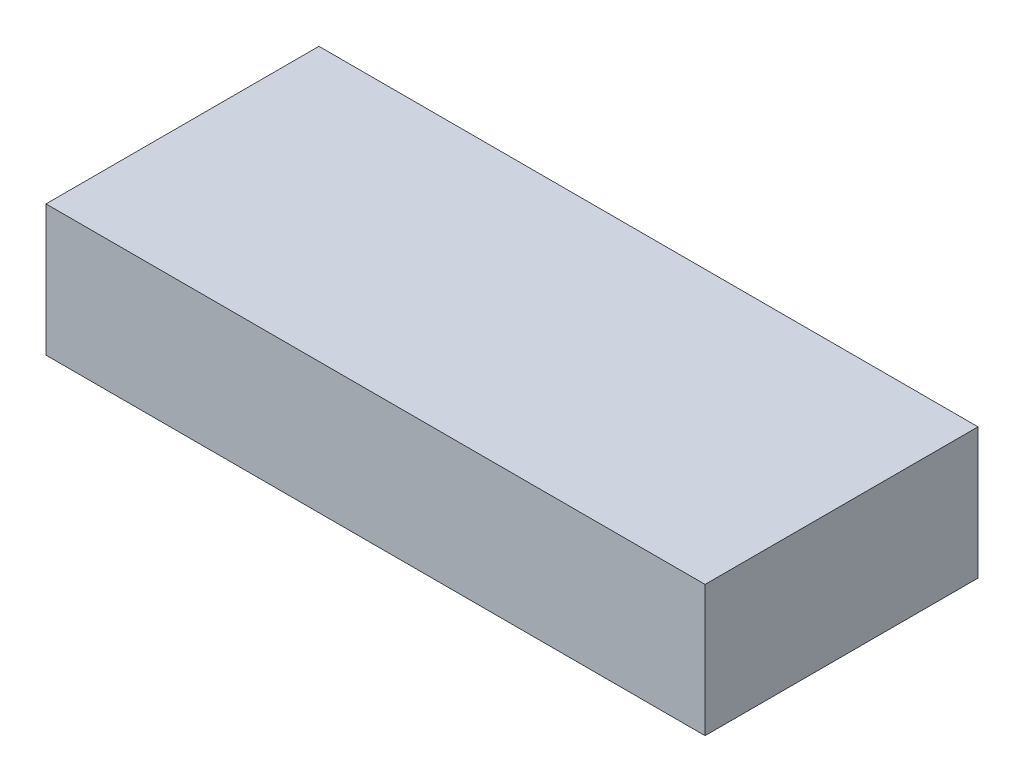
ISO-10303-21;
HEADER;
FILE_DESCRIPTION(('STEP AP214'),'2;1');
FILE_NAME('part.step','',(''),(''),'','','');
FILE_SCHEMA(('AUTOMOTIVE_DESIGN { 1 0 10303 214 1 1 1 1 }'));
ENDSEC;
DATA;
#1=APPLICATION_CONTEXT('core data for automotive mechanical design processes');
#2=APPLICATION_PROTOCOL_DEFINITION('international standard','automotive_design',2000,#1);
#3=PRODUCT_CONTEXT('',#1,'mechanical');
#4=PRODUCT('Part','Part','',(#3));
#5=PRODUCT_RELATED_PRODUCT_CATEGORY('part','',(#4));
#6=PRODUCT_DEFINITION_FORMATION('','',#4);
#7=PRODUCT_DEFINITION_CONTEXT('part definition',#1,'design');
#8=PRODUCT_DEFINITION('design','',#6,#7);
#9=PRODUCT_DEFINITION_SHAPE('','',#8);
#10=(LENGTH_UNIT() NAMED_UNIT(*) SI_UNIT(.MILLI.,.METRE.));
#11=(NAMED_UNIT(*) PLANE_ANGLE_UNIT() SI_UNIT($,.RADIAN.));
#12=(NAMED_UNIT(*) SI_UNIT($,.STERADIAN.) SOLID_ANGLE_UNIT());
#13=UNCERTAINTY_MEASURE_WITH_UNIT(LENGTH_MEASURE(1.E-05),#10,'distance_accuracy_value','');
#14=(GEOMETRIC_REPRESENTATION_CONTEXT(3) GLOBAL_UNCERTAINTY_ASSIGNED_CONTEXT((#13)) GLOBAL_UNIT_ASSIGNED_CONTEXT((#10,
#11,#12)) REPRESENTATION_CONTEXT('',''));
#15=CARTESIAN_POINT('',(0.,0.,0.));
#16=DIRECTION('',(0.,0.,1.));
#17=DIRECTION('',(1.,0.,0.));
#18=AXIS2_PLACEMENT_3D('',#15,#16,#17);
#19=CARTESIAN_POINT('',(25.15,-5.,20.83));
#20=DIRECTION('',(-1.,0.,0.));
#21=DIRECTION('',(0.,0.,1.));
#22=AXIS2_PLACEMENT_3D('',#19,#20,#21);
#23=PLANE('',#22);
#24=DIRECTION('',(0.,1.,0.));
#25=VECTOR('',#24,1.);
#26=CARTESIAN_POINT('',(25.15,-5.,0.));
#27=LINE('',#26,#25);
#28=CARTESIAN_POINT('',(25.15,-5.,0.));
#29=VERTEX_POINT('',#28);
#30=CARTESIAN_POINT('',(25.15,5.,0.));
#31=VERTEX_POINT('',#30);
#32=EDGE_CURVE('E102',#29,#31,#27,.T.);
#33=ORIENTED_EDGE('',*,*,#32,.T.);
#34=DIRECTION('',(0.,0.,-1.));
#35=VECTOR('',#34,1.);
#36=CARTESIAN_POINT('',(25.15,5.,20.83));
#37=LINE('',#36,#35);
#38=CARTESIAN_POINT('',(25.15,5.,20.83));
#39=VERTEX_POINT('',#38);
#40=EDGE_CURVE('E11',#39,#31,#37,.T.);
#41=ORIENTED_EDGE('',*,*,#40,.F.);
#42=DIRECTION('',(0.,1.,0.));
#43=VECTOR('',#42,1.);
#44=CARTESIAN_POINT('',(25.15,-5.,20.83));
#45=LINE('',#44,#43);
#46=CARTESIAN_POINT('',(25.15,-5.,20.83));
#47=VERTEX_POINT('',#46);
#48=EDGE_CURVE('E90',#47,#39,#45,.T.);
#49=ORIENTED_EDGE('',*,*,#48,.F.);
#50=DIRECTION('',(0.,0.,-1.));
#51=VECTOR('',#50,1.);
#52=CARTESIAN_POINT('',(25.15,-5.,20.83));
#53=LINE('',#52,#51);
#54=EDGE_CURVE('E98',#47,#29,#53,.T.);
#55=ORIENTED_EDGE('',*,*,#54,.T.);
#56=EDGE_LOOP('',(#33,#41,#49,#55));
#57=FACE_BOUND('',#56,.T.);
#58=ADVANCED_FACE('F39',(#57),#23,.F.);
#59=CARTESIAN_POINT('',(-25.15,5.,20.83));
#60=DIRECTION('',(0.,-1.,0.));
#61=DIRECTION('',(0.,0.,-1.));
#62=AXIS2_PLACEMENT_3D('',#59,#60,#61);
#63=PLANE('',#62);
#64=DIRECTION('',(-1.,0.,0.));
#65=VECTOR('',#64,1.);
#66=CARTESIAN_POINT('',(-25.15,5.,0.));
#67=LINE('',#66,#65);
#68=CARTESIAN_POINT('',(-25.15,5.,0.));
#69=VERTEX_POINT('',#68);
#70=EDGE_CURVE('E94',#31,#69,#67,.T.);
#71=ORIENTED_EDGE('',*,*,#70,.T.);
#72=DIRECTION('',(0.,0.,-1.));
#73=VECTOR('',#72,1.);
#74=CARTESIAN_POINT('',(-25.15,5.,20.83));
#75=LINE('',#74,#73);
#76=CARTESIAN_POINT('',(-25.15,5.,20.83));
#77=VERTEX_POINT('',#76);
#78=EDGE_CURVE('E47',#77,#69,#75,.T.);
#79=ORIENTED_EDGE('',*,*,#78,.F.);
#80=DIRECTION('',(-1.,0.,0.));
#81=VECTOR('',#80,1.);
#82=CARTESIAN_POINT('',(-25.15,5.,20.83));
#83=LINE('',#82,#81);
#84=EDGE_CURVE('E85',#39,#77,#83,.T.);
#85=ORIENTED_EDGE('',*,*,#84,.F.);
#86=ORIENTED_EDGE('',*,*,#40,.T.);
#87=EDGE_LOOP('',(#71,#79,#85,#86));
#88=FACE_BOUND('',#87,.T.);
#89=ADVANCED_FACE('F93',(#88),#63,.F.);
#90=CARTESIAN_POINT('',(-25.15,-5.,20.83));
#91=DIRECTION('',(1.,0.,0.));
#92=DIRECTION('',(0.,0.,-1.));
#93=AXIS2_PLACEMENT_3D('',#90,#91,#92);
#94=PLANE('',#93);
#95=DIRECTION('',(0.,-1.,0.));
#96=VECTOR('',#95,1.);
#97=CARTESIAN_POINT('',(-25.15,-5.,0.));
#98=LINE('',#97,#96);
#99=CARTESIAN_POINT('',(-25.15,-5.,0.));
#100=VERTEX_POINT('',#99);
#101=EDGE_CURVE('E72',#69,#100,#98,.T.);
#102=ORIENTED_EDGE('',*,*,#101,.T.);
#103=DIRECTION('',(0.,0.,-1.));
#104=VECTOR('',#103,1.);
#105=CARTESIAN_POINT('',(-25.15,-5.,20.83));
#106=LINE('',#105,#104);
#107=CARTESIAN_POINT('',(-25.15,-5.,20.83));
#108=VERTEX_POINT('',#107);
#109=EDGE_CURVE('E95',#108,#100,#106,.T.);
#110=ORIENTED_EDGE('',*,*,#109,.F.);
#111=DIRECTION('',(0.,-1.,0.));
#112=VECTOR('',#111,1.);
#113=CARTESIAN_POINT('',(-25.15,-5.,20.83));
#114=LINE('',#113,#112);
#115=EDGE_CURVE('E88',#77,#108,#114,.T.);
#116=ORIENTED_EDGE('',*,*,#115,.F.);
#117=ORIENTED_EDGE('',*,*,#78,.T.);
#118=EDGE_LOOP('',(#102,#110,#116,#117));
#119=FACE_BOUND('',#118,.T.);
#120=ADVANCED_FACE('F96',(#119),#94,.F.);
#121=CARTESIAN_POINT('',(-25.15,-5.,20.83));
#122=DIRECTION('',(0.,1.,0.));
#123=DIRECTION('',(0.,0.,1.));
#124=AXIS2_PLACEMENT_3D('',#121,#122,#123);
#125=PLANE('',#124);
#126=DIRECTION('',(1.,0.,0.));
#127=VECTOR('',#126,1.);
#128=CARTESIAN_POINT('',(-25.15,-5.,0.));
#129=LINE('',#128,#127);
#130=EDGE_CURVE('E78',#100,#29,#129,.T.);
#131=ORIENTED_EDGE('',*,*,#130,.T.);
#132=ORIENTED_EDGE('',*,*,#54,.F.);
#133=DIRECTION('',(1.,0.,0.));
#134=VECTOR('',#133,1.);
#135=CARTESIAN_POINT('',(-25.15,-5.,20.83));
#136=LINE('',#135,#134);
#137=EDGE_CURVE('E55',#108,#47,#136,.T.);
#138=ORIENTED_EDGE('',*,*,#137,.F.);
#139=ORIENTED_EDGE('',*,*,#109,.T.);
#140=EDGE_LOOP('',(#131,#132,#138,#139));
#141=FACE_BOUND('',#140,.T.);
#142=ADVANCED_FACE('F109',(#141),#125,.F.);
#143=CARTESIAN_POINT('',(0.,0.,20.83));
#144=DIRECTION('',(0.,0.,-1.));
#145=DIRECTION('',(-1.,0.,0.));
#146=AXIS2_PLACEMENT_3D('',#143,#144,#145);
#147=PLANE('',#146);
#148=ORIENTED_EDGE('',*,*,#48,.T.);
#149=ORIENTED_EDGE('',*,*,#84,.T.);
#150=ORIENTED_EDGE('',*,*,#115,.T.);
#151=ORIENTED_EDGE('',*,*,#137,.T.);
#152=EDGE_LOOP('',(#148,#149,#150,#151));
#153=FACE_BOUND('',#152,.T.);
#154=ADVANCED_FACE('F86',(#153),#147,.F.);
#155=CARTESIAN_POINT('',(0.,0.,0.));
#156=DIRECTION('',(0.,0.,-1.));
#157=DIRECTION('',(-1.,0.,0.));
#158=AXIS2_PLACEMENT_3D('',#155,#156,#157);
#159=PLANE('',#158);
#160=ORIENTED_EDGE('',*,*,#32,.F.);
#161=ORIENTED_EDGE('',*,*,#130,.F.);
#162=ORIENTED_EDGE('',*,*,#101,.F.);
#163=ORIENTED_EDGE('',*,*,#70,.F.);
#164=EDGE_LOOP('',(#160,#161,#162,#163));
#165=FACE_BOUND('',#164,.T.);
#166=ADVANCED_FACE('F112',(#165),#159,.T.);
#167=CLOSED_SHELL('',(#58,#89,#120,#142,#154,#166));
#168=MANIFOLD_SOLID_BREP('B2',#167);
#169=ADVANCED_BREP_SHAPE_REPRESENTATION('',(#18,#168),#14);
#170=SHAPE_DEFINITION_REPRESENTATION(#9,#169);
ENDSEC;
END-ISO-10303-21;
